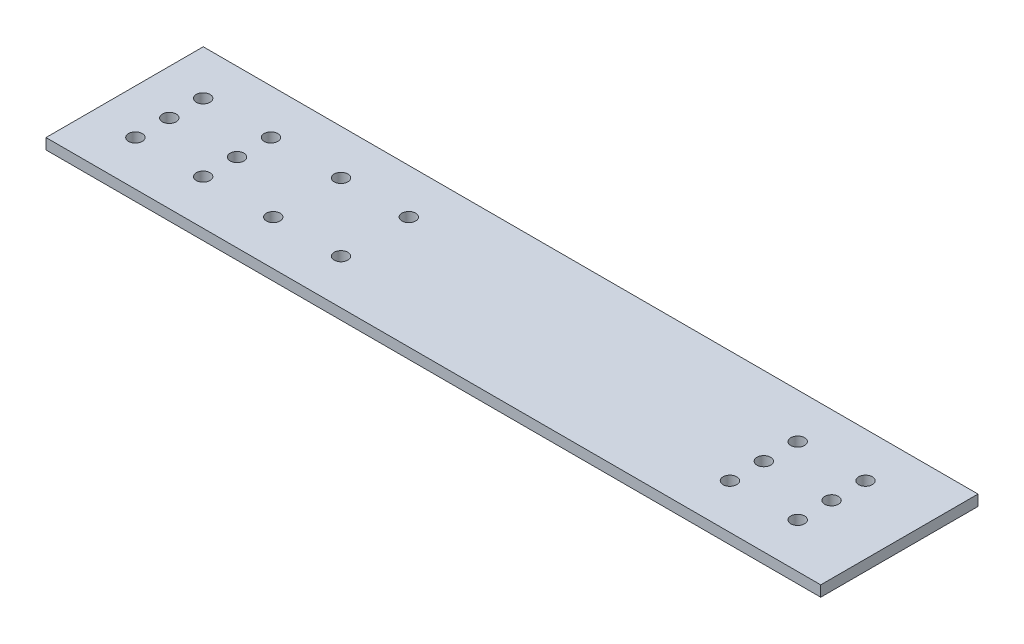
ISO-10303-21;
HEADER;
FILE_DESCRIPTION(('STEP AP214'),'2;1');
FILE_NAME('part.step','',(''),(''),'','','');
FILE_SCHEMA(('AUTOMOTIVE_DESIGN { 1 0 10303 214 1 1 1 1 }'));
ENDSEC;
DATA;
#1=APPLICATION_CONTEXT('core data for automotive mechanical design processes');
#2=APPLICATION_PROTOCOL_DEFINITION('international standard','automotive_design',2000,#1);
#3=PRODUCT_CONTEXT('',#1,'mechanical');
#4=PRODUCT('Part','Part','',(#3));
#5=PRODUCT_RELATED_PRODUCT_CATEGORY('part','',(#4));
#6=PRODUCT_DEFINITION_FORMATION('','',#4);
#7=PRODUCT_DEFINITION_CONTEXT('part definition',#1,'design');
#8=PRODUCT_DEFINITION('design','',#6,#7);
#9=PRODUCT_DEFINITION_SHAPE('','',#8);
#10=(LENGTH_UNIT() NAMED_UNIT(*) SI_UNIT(.MILLI.,.METRE.));
#11=(NAMED_UNIT(*) PLANE_ANGLE_UNIT() SI_UNIT($,.RADIAN.));
#12=(NAMED_UNIT(*) SI_UNIT($,.STERADIAN.) SOLID_ANGLE_UNIT());
#13=UNCERTAINTY_MEASURE_WITH_UNIT(LENGTH_MEASURE(1.E-05),#10,'distance_accuracy_value','');
#14=(GEOMETRIC_REPRESENTATION_CONTEXT(3) GLOBAL_UNCERTAINTY_ASSIGNED_CONTEXT((#13)) GLOBAL_UNIT_ASSIGNED_CONTEXT((#10,
#11,#12)) REPRESENTATION_CONTEXT('',''));
#15=CARTESIAN_POINT('',(0.,0.,0.));
#16=DIRECTION('',(0.,0.,1.));
#17=DIRECTION('',(1.,0.,0.));
#18=AXIS2_PLACEMENT_3D('',#15,#16,#17);
#19=CARTESIAN_POINT('',(0.,6.35,0.));
#20=DIRECTION('',(0.,-1.,0.));
#21=DIRECTION('',(0.,0.,-1.));
#22=AXIS2_PLACEMENT_3D('',#19,#20,#21);
#23=PLANE('',#22);
#24=DIRECTION('',(0.,0.,1.));
#25=VECTOR('',#24,1.);
#26=CARTESIAN_POINT('',(-46.35,6.35,-46.4));
#27=LINE('',#26,#25);
#28=CARTESIAN_POINT('',(-46.35,6.35,-46.4));
#29=VERTEX_POINT('',#28);
#30=CARTESIAN_POINT('',(-46.35,6.35,46.4));
#31=VERTEX_POINT('',#30);
#32=EDGE_CURVE('E86',#29,#31,#27,.T.);
#33=ORIENTED_EDGE('',*,*,#32,.T.);
#34=DIRECTION('',(1.,0.,0.));
#35=VECTOR('',#34,1.);
#36=CARTESIAN_POINT('',(410.85,6.35,46.3999999999999));
#37=LINE('',#36,#35);
#38=CARTESIAN_POINT('',(410.85,6.35,46.3999999999999));
#39=VERTEX_POINT('',#38);
#40=EDGE_CURVE('E81',#31,#39,#37,.T.);
#41=ORIENTED_EDGE('',*,*,#40,.T.);
#42=DIRECTION('',(0.,0.,-1.));
#43=VECTOR('',#42,1.);
#44=CARTESIAN_POINT('',(410.85,6.35,-46.4));
#45=LINE('',#44,#43);
#46=CARTESIAN_POINT('',(410.85,6.35,-46.4));
#47=VERTEX_POINT('',#46);
#48=EDGE_CURVE('E84',#39,#47,#45,.T.);
#49=ORIENTED_EDGE('',*,*,#48,.T.);
#50=DIRECTION('',(-1.,0.,0.));
#51=VECTOR('',#50,1.);
#52=CARTESIAN_POINT('',(-46.35,6.35,-46.4));
#53=LINE('',#52,#51);
#54=EDGE_CURVE('E51',#47,#29,#53,.T.);
#55=ORIENTED_EDGE('',*,*,#54,.T.);
#56=EDGE_LOOP('',(#33,#41,#49,#55));
#57=FACE_BOUND('',#56,.T.);
#58=CARTESIAN_POINT('',(-20.,6.35,-20.));
#59=DIRECTION('',(0.,1.,0.));
#60=DIRECTION('',(0.,0.,1.));
#61=AXIS2_PLACEMENT_3D('',#58,#59,#60);
#62=CIRCLE('',#61,4.05);
#63=CARTESIAN_POINT('',(-20.,6.35,-15.95));
#64=VERTEX_POINT('',#63);
#65=EDGE_CURVE('E101',#64,#64,#62,.T.);
#66=ORIENTED_EDGE('',*,*,#65,.F.);
#67=EDGE_LOOP('',(#66));
#68=FACE_BOUND('',#67,.T.);
#69=CARTESIAN_POINT('',(20.,6.35,-20.));
#70=DIRECTION('',(0.,1.,0.));
#71=DIRECTION('',(0.,0.,1.));
#72=AXIS2_PLACEMENT_3D('',#69,#70,#71);
#73=CIRCLE('',#72,4.05);
#74=CARTESIAN_POINT('',(20.,6.35,-15.95));
#75=VERTEX_POINT('',#74);
#76=EDGE_CURVE('E116',#75,#75,#73,.T.);
#77=ORIENTED_EDGE('',*,*,#76,.F.);
#78=EDGE_LOOP('',(#77));
#79=FACE_BOUND('',#78,.T.);
#80=CARTESIAN_POINT('',(20.,6.35,20.));
#81=DIRECTION('',(0.,1.,0.));
#82=DIRECTION('',(0.,0.,1.));
#83=AXIS2_PLACEMENT_3D('',#80,#81,#82);
#84=CIRCLE('',#83,4.05);
#85=CARTESIAN_POINT('',(20.,6.35,24.05));
#86=VERTEX_POINT('',#85);
#87=EDGE_CURVE('E122',#86,#86,#84,.T.);
#88=ORIENTED_EDGE('',*,*,#87,.F.);
#89=EDGE_LOOP('',(#88));
#90=FACE_BOUND('',#89,.T.);
#91=CARTESIAN_POINT('',(-20.,6.35,20.));
#92=DIRECTION('',(0.,1.,0.));
#93=DIRECTION('',(0.,0.,1.));
#94=AXIS2_PLACEMENT_3D('',#91,#92,#93);
#95=CIRCLE('',#94,4.05);
#96=CARTESIAN_POINT('',(-20.,6.35,24.05));
#97=VERTEX_POINT('',#96);
#98=EDGE_CURVE('E128',#97,#97,#95,.T.);
#99=ORIENTED_EDGE('',*,*,#98,.F.);
#100=EDGE_LOOP('',(#99));
#101=FACE_BOUND('',#100,.T.);
#102=CARTESIAN_POINT('',(-20.,6.35,0.));
#103=DIRECTION('',(0.,1.,0.));
#104=DIRECTION('',(0.,0.,1.));
#105=AXIS2_PLACEMENT_3D('',#102,#103,#104);
#106=CIRCLE('',#105,4.05);
#107=CARTESIAN_POINT('',(-20.,6.35,4.05));
#108=VERTEX_POINT('',#107);
#109=EDGE_CURVE('E134',#108,#108,#106,.T.);
#110=ORIENTED_EDGE('',*,*,#109,.F.);
#111=EDGE_LOOP('',(#110));
#112=FACE_BOUND('',#111,.T.);
#113=CARTESIAN_POINT('',(20.,6.35,0.));
#114=DIRECTION('',(0.,1.,0.));
#115=DIRECTION('',(0.,0.,1.));
#116=AXIS2_PLACEMENT_3D('',#113,#114,#115);
#117=CIRCLE('',#116,4.05);
#118=CARTESIAN_POINT('',(20.,6.35,4.05));
#119=VERTEX_POINT('',#118);
#120=EDGE_CURVE('E140',#119,#119,#117,.T.);
#121=ORIENTED_EDGE('',*,*,#120,.F.);
#122=EDGE_LOOP('',(#121));
#123=FACE_BOUND('',#122,.T.);
#124=CARTESIAN_POINT('',(330.85,6.35,-20.));
#125=DIRECTION('',(0.,1.,0.));
#126=DIRECTION('',(0.,0.,1.));
#127=AXIS2_PLACEMENT_3D('',#124,#125,#126);
#128=CIRCLE('',#127,4.05000000000002);
#129=CARTESIAN_POINT('',(330.85,6.35,-15.95));
#130=VERTEX_POINT('',#129);
#131=EDGE_CURVE('E146',#130,#130,#128,.T.);
#132=ORIENTED_EDGE('',*,*,#131,.F.);
#133=EDGE_LOOP('',(#132));
#134=FACE_BOUND('',#133,.T.);
#135=CARTESIAN_POINT('',(370.85,6.35,-20.));
#136=DIRECTION('',(0.,1.,0.));
#137=DIRECTION('',(0.,0.,1.));
#138=AXIS2_PLACEMENT_3D('',#135,#136,#137);
#139=CIRCLE('',#138,4.05000000000002);
#140=CARTESIAN_POINT('',(370.85,6.35,-15.95));
#141=VERTEX_POINT('',#140);
#142=EDGE_CURVE('E152',#141,#141,#139,.T.);
#143=ORIENTED_EDGE('',*,*,#142,.F.);
#144=EDGE_LOOP('',(#143));
#145=FACE_BOUND('',#144,.T.);
#146=CARTESIAN_POINT('',(370.85,6.35,20.));
#147=DIRECTION('',(0.,1.,0.));
#148=DIRECTION('',(0.,0.,1.));
#149=AXIS2_PLACEMENT_3D('',#146,#147,#148);
#150=CIRCLE('',#149,4.05000000000002);
#151=CARTESIAN_POINT('',(370.85,6.35,24.05));
#152=VERTEX_POINT('',#151);
#153=EDGE_CURVE('E158',#152,#152,#150,.T.);
#154=ORIENTED_EDGE('',*,*,#153,.F.);
#155=EDGE_LOOP('',(#154));
#156=FACE_BOUND('',#155,.T.);
#157=CARTESIAN_POINT('',(330.85,6.35,20.));
#158=DIRECTION('',(0.,1.,0.));
#159=DIRECTION('',(0.,0.,1.));
#160=AXIS2_PLACEMENT_3D('',#157,#158,#159);
#161=CIRCLE('',#160,4.05000000000002);
#162=CARTESIAN_POINT('',(330.85,6.35,24.05));
#163=VERTEX_POINT('',#162);
#164=EDGE_CURVE('E164',#163,#163,#161,.T.);
#165=ORIENTED_EDGE('',*,*,#164,.F.);
#166=EDGE_LOOP('',(#165));
#167=FACE_BOUND('',#166,.T.);
#168=CARTESIAN_POINT('',(61.35,6.35,-20.));
#169=DIRECTION('',(0.,1.,0.));
#170=DIRECTION('',(0.,0.,1.));
#171=AXIS2_PLACEMENT_3D('',#168,#169,#170);
#172=CIRCLE('',#171,4.05);
#173=CARTESIAN_POINT('',(61.35,6.35,-15.95));
#174=VERTEX_POINT('',#173);
#175=EDGE_CURVE('E170',#174,#174,#172,.T.);
#176=ORIENTED_EDGE('',*,*,#175,.F.);
#177=EDGE_LOOP('',(#176));
#178=FACE_BOUND('',#177,.T.);
#179=CARTESIAN_POINT('',(101.35,6.35,-20.));
#180=DIRECTION('',(0.,1.,0.));
#181=DIRECTION('',(0.,0.,1.));
#182=AXIS2_PLACEMENT_3D('',#179,#180,#181);
#183=CIRCLE('',#182,4.04999999999999);
#184=CARTESIAN_POINT('',(101.35,6.35,-15.95));
#185=VERTEX_POINT('',#184);
#186=EDGE_CURVE('E176',#185,#185,#183,.T.);
#187=ORIENTED_EDGE('',*,*,#186,.F.);
#188=EDGE_LOOP('',(#187));
#189=FACE_BOUND('',#188,.T.);
#190=CARTESIAN_POINT('',(330.85,6.35,0.));
#191=DIRECTION('',(0.,1.,0.));
#192=DIRECTION('',(0.,0.,1.));
#193=AXIS2_PLACEMENT_3D('',#190,#191,#192);
#194=CIRCLE('',#193,4.05000000000002);
#195=CARTESIAN_POINT('',(330.85,6.35,4.05000000000004));
#196=VERTEX_POINT('',#195);
#197=EDGE_CURVE('E182',#196,#196,#194,.T.);
#198=ORIENTED_EDGE('',*,*,#197,.F.);
#199=EDGE_LOOP('',(#198));
#200=FACE_BOUND('',#199,.T.);
#201=CARTESIAN_POINT('',(370.85,6.35,0.));
#202=DIRECTION('',(0.,1.,0.));
#203=DIRECTION('',(0.,0.,1.));
#204=AXIS2_PLACEMENT_3D('',#201,#202,#203);
#205=CIRCLE('',#204,4.05000000000002);
#206=CARTESIAN_POINT('',(370.85,6.35,4.05000000000004));
#207=VERTEX_POINT('',#206);
#208=EDGE_CURVE('E188',#207,#207,#205,.T.);
#209=ORIENTED_EDGE('',*,*,#208,.F.);
#210=EDGE_LOOP('',(#209));
#211=FACE_BOUND('',#210,.T.);
#212=CARTESIAN_POINT('',(101.35,6.35,20.));
#213=DIRECTION('',(0.,1.,0.));
#214=DIRECTION('',(0.,0.,1.));
#215=AXIS2_PLACEMENT_3D('',#212,#213,#214);
#216=CIRCLE('',#215,4.04999999999999);
#217=CARTESIAN_POINT('',(101.35,6.35,24.05));
#218=VERTEX_POINT('',#217);
#219=EDGE_CURVE('E194',#218,#218,#216,.T.);
#220=ORIENTED_EDGE('',*,*,#219,.F.);
#221=EDGE_LOOP('',(#220));
#222=FACE_BOUND('',#221,.T.);
#223=CARTESIAN_POINT('',(61.35,6.35,20.));
#224=DIRECTION('',(0.,1.,0.));
#225=DIRECTION('',(0.,0.,1.));
#226=AXIS2_PLACEMENT_3D('',#223,#224,#225);
#227=CIRCLE('',#226,4.05);
#228=CARTESIAN_POINT('',(61.35,6.35,24.05));
#229=VERTEX_POINT('',#228);
#230=EDGE_CURVE('E200',#229,#229,#227,.T.);
#231=ORIENTED_EDGE('',*,*,#230,.F.);
#232=EDGE_LOOP('',(#231));
#233=FACE_BOUND('',#232,.T.);
#234=ADVANCED_FACE('F34',(#57,#68,#79,#90,#101,#112,#123,#134,#145,#156,#167,#178,#189,#200,
#211,#222,#233),#23,.F.);
#235=CARTESIAN_POINT('',(0.,0.,0.));
#236=DIRECTION('',(0.,-1.,0.));
#237=DIRECTION('',(0.,0.,-1.));
#238=AXIS2_PLACEMENT_3D('',#235,#236,#237);
#239=PLANE('',#238);
#240=CARTESIAN_POINT('',(101.35,0.,20.));
#241=DIRECTION('',(0.,1.,0.));
#242=DIRECTION('',(0.,0.,1.));
#243=AXIS2_PLACEMENT_3D('',#240,#241,#242);
#244=CIRCLE('',#243,4.04999999999999);
#245=CARTESIAN_POINT('',(101.35,0.,24.05));
#246=VERTEX_POINT('',#245);
#247=EDGE_CURVE('E197',#246,#246,#244,.T.);
#248=ORIENTED_EDGE('',*,*,#247,.T.);
#249=EDGE_LOOP('',(#248));
#250=FACE_BOUND('',#249,.T.);
#251=CARTESIAN_POINT('',(330.85,0.,0.));
#252=DIRECTION('',(0.,1.,0.));
#253=DIRECTION('',(0.,0.,1.));
#254=AXIS2_PLACEMENT_3D('',#251,#252,#253);
#255=CIRCLE('',#254,4.05000000000002);
#256=CARTESIAN_POINT('',(330.85,0.,4.05000000000004));
#257=VERTEX_POINT('',#256);
#258=EDGE_CURVE('E185',#257,#257,#255,.T.);
#259=ORIENTED_EDGE('',*,*,#258,.T.);
#260=EDGE_LOOP('',(#259));
#261=FACE_BOUND('',#260,.T.);
#262=CARTESIAN_POINT('',(61.35,0.,-20.));
#263=DIRECTION('',(0.,1.,0.));
#264=DIRECTION('',(0.,0.,1.));
#265=AXIS2_PLACEMENT_3D('',#262,#263,#264);
#266=CIRCLE('',#265,4.05);
#267=CARTESIAN_POINT('',(61.35,0.,-15.95));
#268=VERTEX_POINT('',#267);
#269=EDGE_CURVE('E173',#268,#268,#266,.T.);
#270=ORIENTED_EDGE('',*,*,#269,.T.);
#271=EDGE_LOOP('',(#270));
#272=FACE_BOUND('',#271,.T.);
#273=CARTESIAN_POINT('',(370.85,0.,20.));
#274=DIRECTION('',(0.,1.,0.));
#275=DIRECTION('',(0.,0.,1.));
#276=AXIS2_PLACEMENT_3D('',#273,#274,#275);
#277=CIRCLE('',#276,4.05000000000002);
#278=CARTESIAN_POINT('',(370.85,0.,24.05));
#279=VERTEX_POINT('',#278);
#280=EDGE_CURVE('E161',#279,#279,#277,.T.);
#281=ORIENTED_EDGE('',*,*,#280,.T.);
#282=EDGE_LOOP('',(#281));
#283=FACE_BOUND('',#282,.T.);
#284=CARTESIAN_POINT('',(330.85,0.,-20.));
#285=DIRECTION('',(0.,1.,0.));
#286=DIRECTION('',(0.,0.,1.));
#287=AXIS2_PLACEMENT_3D('',#284,#285,#286);
#288=CIRCLE('',#287,4.05000000000002);
#289=CARTESIAN_POINT('',(330.85,0.,-15.95));
#290=VERTEX_POINT('',#289);
#291=EDGE_CURVE('E149',#290,#290,#288,.T.);
#292=ORIENTED_EDGE('',*,*,#291,.T.);
#293=EDGE_LOOP('',(#292));
#294=FACE_BOUND('',#293,.T.);
#295=CARTESIAN_POINT('',(-20.,0.,0.));
#296=DIRECTION('',(0.,1.,0.));
#297=DIRECTION('',(0.,0.,1.));
#298=AXIS2_PLACEMENT_3D('',#295,#296,#297);
#299=CIRCLE('',#298,4.05);
#300=CARTESIAN_POINT('',(-20.,0.,4.05));
#301=VERTEX_POINT('',#300);
#302=EDGE_CURVE('E137',#301,#301,#299,.T.);
#303=ORIENTED_EDGE('',*,*,#302,.T.);
#304=EDGE_LOOP('',(#303));
#305=FACE_BOUND('',#304,.T.);
#306=CARTESIAN_POINT('',(20.,0.,20.));
#307=DIRECTION('',(0.,1.,0.));
#308=DIRECTION('',(0.,0.,1.));
#309=AXIS2_PLACEMENT_3D('',#306,#307,#308);
#310=CIRCLE('',#309,4.05);
#311=CARTESIAN_POINT('',(20.,0.,24.05));
#312=VERTEX_POINT('',#311);
#313=EDGE_CURVE('E125',#312,#312,#310,.T.);
#314=ORIENTED_EDGE('',*,*,#313,.T.);
#315=EDGE_LOOP('',(#314));
#316=FACE_BOUND('',#315,.T.);
#317=CARTESIAN_POINT('',(-20.,0.,-20.));
#318=DIRECTION('',(0.,1.,0.));
#319=DIRECTION('',(0.,0.,1.));
#320=AXIS2_PLACEMENT_3D('',#317,#318,#319);
#321=CIRCLE('',#320,4.05);
#322=CARTESIAN_POINT('',(-20.,0.,-15.95));
#323=VERTEX_POINT('',#322);
#324=EDGE_CURVE('E113',#323,#323,#321,.T.);
#325=ORIENTED_EDGE('',*,*,#324,.T.);
#326=EDGE_LOOP('',(#325));
#327=FACE_BOUND('',#326,.T.);
#328=DIRECTION('',(0.,0.,1.));
#329=VECTOR('',#328,1.);
#330=CARTESIAN_POINT('',(-46.35,0.,-46.4));
#331=LINE('',#330,#329);
#332=CARTESIAN_POINT('',(-46.35,0.,-46.4));
#333=VERTEX_POINT('',#332);
#334=CARTESIAN_POINT('',(-46.35,0.,46.4));
#335=VERTEX_POINT('',#334);
#336=EDGE_CURVE('E98',#333,#335,#331,.T.);
#337=ORIENTED_EDGE('',*,*,#336,.F.);
#338=DIRECTION('',(-1.,0.,0.));
#339=VECTOR('',#338,1.);
#340=CARTESIAN_POINT('',(-46.35,0.,-46.4));
#341=LINE('',#340,#339);
#342=CARTESIAN_POINT('',(410.85,0.,-46.4));
#343=VERTEX_POINT('',#342);
#344=EDGE_CURVE('E74',#343,#333,#341,.T.);
#345=ORIENTED_EDGE('',*,*,#344,.F.);
#346=DIRECTION('',(0.,0.,-1.));
#347=VECTOR('',#346,1.);
#348=CARTESIAN_POINT('',(410.85,0.,-46.4));
#349=LINE('',#348,#347);
#350=CARTESIAN_POINT('',(410.85,0.,46.3999999999999));
#351=VERTEX_POINT('',#350);
#352=EDGE_CURVE('E68',#351,#343,#349,.T.);
#353=ORIENTED_EDGE('',*,*,#352,.F.);
#354=DIRECTION('',(1.,0.,0.));
#355=VECTOR('',#354,1.);
#356=CARTESIAN_POINT('',(410.85,0.,46.3999999999999));
#357=LINE('',#356,#355);
#358=EDGE_CURVE('E90',#335,#351,#357,.T.);
#359=ORIENTED_EDGE('',*,*,#358,.F.);
#360=EDGE_LOOP('',(#337,#345,#353,#359));
#361=FACE_BOUND('',#360,.T.);
#362=CARTESIAN_POINT('',(20.,0.,-20.));
#363=DIRECTION('',(0.,1.,0.));
#364=DIRECTION('',(0.,0.,1.));
#365=AXIS2_PLACEMENT_3D('',#362,#363,#364);
#366=CIRCLE('',#365,4.05);
#367=CARTESIAN_POINT('',(20.,0.,-15.95));
#368=VERTEX_POINT('',#367);
#369=EDGE_CURVE('E119',#368,#368,#366,.T.);
#370=ORIENTED_EDGE('',*,*,#369,.T.);
#371=EDGE_LOOP('',(#370));
#372=FACE_BOUND('',#371,.T.);
#373=CARTESIAN_POINT('',(-20.,0.,20.));
#374=DIRECTION('',(0.,1.,0.));
#375=DIRECTION('',(0.,0.,1.));
#376=AXIS2_PLACEMENT_3D('',#373,#374,#375);
#377=CIRCLE('',#376,4.05);
#378=CARTESIAN_POINT('',(-20.,0.,24.05));
#379=VERTEX_POINT('',#378);
#380=EDGE_CURVE('E131',#379,#379,#377,.T.);
#381=ORIENTED_EDGE('',*,*,#380,.T.);
#382=EDGE_LOOP('',(#381));
#383=FACE_BOUND('',#382,.T.);
#384=CARTESIAN_POINT('',(20.,0.,0.));
#385=DIRECTION('',(0.,1.,0.));
#386=DIRECTION('',(0.,0.,1.));
#387=AXIS2_PLACEMENT_3D('',#384,#385,#386);
#388=CIRCLE('',#387,4.05);
#389=CARTESIAN_POINT('',(20.,0.,4.05));
#390=VERTEX_POINT('',#389);
#391=EDGE_CURVE('E143',#390,#390,#388,.T.);
#392=ORIENTED_EDGE('',*,*,#391,.T.);
#393=EDGE_LOOP('',(#392));
#394=FACE_BOUND('',#393,.T.);
#395=CARTESIAN_POINT('',(370.85,0.,-20.));
#396=DIRECTION('',(0.,1.,0.));
#397=DIRECTION('',(0.,0.,1.));
#398=AXIS2_PLACEMENT_3D('',#395,#396,#397);
#399=CIRCLE('',#398,4.05000000000002);
#400=CARTESIAN_POINT('',(370.85,0.,-15.95));
#401=VERTEX_POINT('',#400);
#402=EDGE_CURVE('E155',#401,#401,#399,.T.);
#403=ORIENTED_EDGE('',*,*,#402,.T.);
#404=EDGE_LOOP('',(#403));
#405=FACE_BOUND('',#404,.T.);
#406=CARTESIAN_POINT('',(330.85,0.,20.));
#407=DIRECTION('',(0.,1.,0.));
#408=DIRECTION('',(0.,0.,1.));
#409=AXIS2_PLACEMENT_3D('',#406,#407,#408);
#410=CIRCLE('',#409,4.05000000000002);
#411=CARTESIAN_POINT('',(330.85,0.,24.05));
#412=VERTEX_POINT('',#411);
#413=EDGE_CURVE('E167',#412,#412,#410,.T.);
#414=ORIENTED_EDGE('',*,*,#413,.T.);
#415=EDGE_LOOP('',(#414));
#416=FACE_BOUND('',#415,.T.);
#417=CARTESIAN_POINT('',(101.35,0.,-20.));
#418=DIRECTION('',(0.,1.,0.));
#419=DIRECTION('',(0.,0.,1.));
#420=AXIS2_PLACEMENT_3D('',#417,#418,#419);
#421=CIRCLE('',#420,4.04999999999999);
#422=CARTESIAN_POINT('',(101.35,0.,-15.95));
#423=VERTEX_POINT('',#422);
#424=EDGE_CURVE('E179',#423,#423,#421,.T.);
#425=ORIENTED_EDGE('',*,*,#424,.T.);
#426=EDGE_LOOP('',(#425));
#427=FACE_BOUND('',#426,.T.);
#428=CARTESIAN_POINT('',(370.85,0.,0.));
#429=DIRECTION('',(0.,1.,0.));
#430=DIRECTION('',(0.,0.,1.));
#431=AXIS2_PLACEMENT_3D('',#428,#429,#430);
#432=CIRCLE('',#431,4.05000000000002);
#433=CARTESIAN_POINT('',(370.85,0.,4.05000000000004));
#434=VERTEX_POINT('',#433);
#435=EDGE_CURVE('E191',#434,#434,#432,.T.);
#436=ORIENTED_EDGE('',*,*,#435,.T.);
#437=EDGE_LOOP('',(#436));
#438=FACE_BOUND('',#437,.T.);
#439=CARTESIAN_POINT('',(61.35,0.,20.));
#440=DIRECTION('',(0.,1.,0.));
#441=DIRECTION('',(0.,0.,1.));
#442=AXIS2_PLACEMENT_3D('',#439,#440,#441);
#443=CIRCLE('',#442,4.05);
#444=CARTESIAN_POINT('',(61.35,0.,24.05));
#445=VERTEX_POINT('',#444);
#446=EDGE_CURVE('E203',#445,#445,#443,.T.);
#447=ORIENTED_EDGE('',*,*,#446,.T.);
#448=EDGE_LOOP('',(#447));
#449=FACE_BOUND('',#448,.T.);
#450=ADVANCED_FACE('F109',(#250,#261,#272,#283,#294,#305,#316,#327,#361,#372,#383,#394,#405,
#416,#427,#438,#449),#239,.T.);
#451=CARTESIAN_POINT('',(-46.35,6.35,-46.4));
#452=DIRECTION('',(1.,0.,0.));
#453=DIRECTION('',(0.,0.,-1.));
#454=AXIS2_PLACEMENT_3D('',#451,#452,#453);
#455=PLANE('',#454);
#456=ORIENTED_EDGE('',*,*,#336,.T.);
#457=DIRECTION('',(0.,-1.,0.));
#458=VECTOR('',#457,1.);
#459=CARTESIAN_POINT('',(-46.35,6.35,46.4));
#460=LINE('',#459,#458);
#461=EDGE_CURVE('E11',#31,#335,#460,.T.);
#462=ORIENTED_EDGE('',*,*,#461,.F.);
#463=ORIENTED_EDGE('',*,*,#32,.F.);
#464=DIRECTION('',(0.,-1.,0.));
#465=VECTOR('',#464,1.);
#466=CARTESIAN_POINT('',(-46.35,6.35,-46.4));
#467=LINE('',#466,#465);
#468=EDGE_CURVE('E94',#29,#333,#467,.T.);
#469=ORIENTED_EDGE('',*,*,#468,.T.);
#470=EDGE_LOOP('',(#456,#462,#463,#469));
#471=FACE_BOUND('',#470,.T.);
#472=ADVANCED_FACE('F36',(#471),#455,.F.);
#473=CARTESIAN_POINT('',(410.85,6.35,46.3999999999999));
#474=DIRECTION('',(0.,0.,-1.));
#475=DIRECTION('',(-1.,0.,0.));
#476=AXIS2_PLACEMENT_3D('',#473,#474,#475);
#477=PLANE('',#476);
#478=ORIENTED_EDGE('',*,*,#358,.T.);
#479=DIRECTION('',(0.,-1.,0.));
#480=VECTOR('',#479,1.);
#481=CARTESIAN_POINT('',(410.85,6.35,46.3999999999999));
#482=LINE('',#481,#480);
#483=EDGE_CURVE('E43',#39,#351,#482,.T.);
#484=ORIENTED_EDGE('',*,*,#483,.F.);
#485=ORIENTED_EDGE('',*,*,#40,.F.);
#486=ORIENTED_EDGE('',*,*,#461,.T.);
#487=EDGE_LOOP('',(#478,#484,#485,#486));
#488=FACE_BOUND('',#487,.T.);
#489=ADVANCED_FACE('F89',(#488),#477,.F.);
#490=CARTESIAN_POINT('',(410.85,6.35,-46.4));
#491=DIRECTION('',(-1.,0.,0.));
#492=DIRECTION('',(0.,0.,1.));
#493=AXIS2_PLACEMENT_3D('',#490,#491,#492);
#494=PLANE('',#493);
#495=ORIENTED_EDGE('',*,*,#352,.T.);
#496=DIRECTION('',(0.,-1.,0.));
#497=VECTOR('',#496,1.);
#498=CARTESIAN_POINT('',(410.85,6.35,-46.4));
#499=LINE('',#498,#497);
#500=EDGE_CURVE('E91',#47,#343,#499,.T.);
#501=ORIENTED_EDGE('',*,*,#500,.F.);
#502=ORIENTED_EDGE('',*,*,#48,.F.);
#503=ORIENTED_EDGE('',*,*,#483,.T.);
#504=EDGE_LOOP('',(#495,#501,#502,#503));
#505=FACE_BOUND('',#504,.T.);
#506=ADVANCED_FACE('F92',(#505),#494,.F.);
#507=CARTESIAN_POINT('',(-46.35,6.35,-46.4));
#508=DIRECTION('',(0.,0.,1.));
#509=DIRECTION('',(1.,0.,0.));
#510=AXIS2_PLACEMENT_3D('',#507,#508,#509);
#511=PLANE('',#510);
#512=ORIENTED_EDGE('',*,*,#344,.T.);
#513=ORIENTED_EDGE('',*,*,#468,.F.);
#514=ORIENTED_EDGE('',*,*,#54,.F.);
#515=ORIENTED_EDGE('',*,*,#500,.T.);
#516=EDGE_LOOP('',(#512,#513,#514,#515));
#517=FACE_BOUND('',#516,.T.);
#518=ADVANCED_FACE('F106',(#517),#511,.F.);
#519=CARTESIAN_POINT('',(-20.,6.35,-20.));
#520=DIRECTION('',(0.,-1.,0.));
#521=DIRECTION('',(0.,0.,-1.));
#522=AXIS2_PLACEMENT_3D('',#519,#520,#521);
#523=CYLINDRICAL_SURFACE('',#522,4.05);
#524=ORIENTED_EDGE('',*,*,#65,.T.);
#525=EDGE_LOOP('',(#524));
#526=FACE_BOUND('',#525,.T.);
#527=ORIENTED_EDGE('',*,*,#324,.F.);
#528=EDGE_LOOP('',(#527));
#529=FACE_BOUND('',#528,.T.);
#530=ADVANCED_FACE('F220',(#526,#529),#523,.F.);
#531=CARTESIAN_POINT('',(20.,6.35,-20.));
#532=DIRECTION('',(0.,-1.,0.));
#533=DIRECTION('',(0.,0.,-1.));
#534=AXIS2_PLACEMENT_3D('',#531,#532,#533);
#535=CYLINDRICAL_SURFACE('',#534,4.05);
#536=ORIENTED_EDGE('',*,*,#76,.T.);
#537=EDGE_LOOP('',(#536));
#538=FACE_BOUND('',#537,.T.);
#539=ORIENTED_EDGE('',*,*,#369,.F.);
#540=EDGE_LOOP('',(#539));
#541=FACE_BOUND('',#540,.T.);
#542=ADVANCED_FACE('F266',(#538,#541),#535,.F.);
#543=CARTESIAN_POINT('',(20.,6.35,20.));
#544=DIRECTION('',(0.,-1.,0.));
#545=DIRECTION('',(0.,0.,-1.));
#546=AXIS2_PLACEMENT_3D('',#543,#544,#545);
#547=CYLINDRICAL_SURFACE('',#546,4.05);
#548=ORIENTED_EDGE('',*,*,#87,.T.);
#549=EDGE_LOOP('',(#548));
#550=FACE_BOUND('',#549,.T.);
#551=ORIENTED_EDGE('',*,*,#313,.F.);
#552=EDGE_LOOP('',(#551));
#553=FACE_BOUND('',#552,.T.);
#554=ADVANCED_FACE('F274',(#550,#553),#547,.F.);
#555=CARTESIAN_POINT('',(-20.,6.35,20.));
#556=DIRECTION('',(0.,-1.,0.));
#557=DIRECTION('',(0.,0.,-1.));
#558=AXIS2_PLACEMENT_3D('',#555,#556,#557);
#559=CYLINDRICAL_SURFACE('',#558,4.05);
#560=ORIENTED_EDGE('',*,*,#98,.T.);
#561=EDGE_LOOP('',(#560));
#562=FACE_BOUND('',#561,.T.);
#563=ORIENTED_EDGE('',*,*,#380,.F.);
#564=EDGE_LOOP('',(#563));
#565=FACE_BOUND('',#564,.T.);
#566=ADVANCED_FACE('F282',(#562,#565),#559,.F.);
#567=CARTESIAN_POINT('',(-20.,6.35,0.));
#568=DIRECTION('',(0.,-1.,0.));
#569=DIRECTION('',(0.,0.,-1.));
#570=AXIS2_PLACEMENT_3D('',#567,#568,#569);
#571=CYLINDRICAL_SURFACE('',#570,4.05);
#572=ORIENTED_EDGE('',*,*,#109,.T.);
#573=EDGE_LOOP('',(#572));
#574=FACE_BOUND('',#573,.T.);
#575=ORIENTED_EDGE('',*,*,#302,.F.);
#576=EDGE_LOOP('',(#575));
#577=FACE_BOUND('',#576,.T.);
#578=ADVANCED_FACE('F291',(#574,#577),#571,.F.);
#579=CARTESIAN_POINT('',(20.,6.35,0.));
#580=DIRECTION('',(0.,-1.,0.));
#581=DIRECTION('',(0.,0.,-1.));
#582=AXIS2_PLACEMENT_3D('',#579,#580,#581);
#583=CYLINDRICAL_SURFACE('',#582,4.05);
#584=ORIENTED_EDGE('',*,*,#120,.T.);
#585=EDGE_LOOP('',(#584));
#586=FACE_BOUND('',#585,.T.);
#587=ORIENTED_EDGE('',*,*,#391,.F.);
#588=EDGE_LOOP('',(#587));
#589=FACE_BOUND('',#588,.T.);
#590=ADVANCED_FACE('F300',(#586,#589),#583,.F.);
#591=CARTESIAN_POINT('',(330.85,6.35,-20.));
#592=DIRECTION('',(0.,-1.,0.));
#593=DIRECTION('',(0.,0.,-1.));
#594=AXIS2_PLACEMENT_3D('',#591,#592,#593);
#595=CYLINDRICAL_SURFACE('',#594,4.05000000000002);
#596=ORIENTED_EDGE('',*,*,#131,.T.);
#597=EDGE_LOOP('',(#596));
#598=FACE_BOUND('',#597,.T.);
#599=ORIENTED_EDGE('',*,*,#291,.F.);
#600=EDGE_LOOP('',(#599));
#601=FACE_BOUND('',#600,.T.);
#602=ADVANCED_FACE('F309',(#598,#601),#595,.F.);
#603=CARTESIAN_POINT('',(370.85,6.35,-20.));
#604=DIRECTION('',(0.,-1.,0.));
#605=DIRECTION('',(0.,0.,-1.));
#606=AXIS2_PLACEMENT_3D('',#603,#604,#605);
#607=CYLINDRICAL_SURFACE('',#606,4.05000000000002);
#608=ORIENTED_EDGE('',*,*,#142,.T.);
#609=EDGE_LOOP('',(#608));
#610=FACE_BOUND('',#609,.T.);
#611=ORIENTED_EDGE('',*,*,#402,.F.);
#612=EDGE_LOOP('',(#611));
#613=FACE_BOUND('',#612,.T.);
#614=ADVANCED_FACE('F318',(#610,#613),#607,.F.);
#615=CARTESIAN_POINT('',(370.85,6.35,20.));
#616=DIRECTION('',(0.,-1.,0.));
#617=DIRECTION('',(0.,0.,-1.));
#618=AXIS2_PLACEMENT_3D('',#615,#616,#617);
#619=CYLINDRICAL_SURFACE('',#618,4.05000000000002);
#620=ORIENTED_EDGE('',*,*,#153,.T.);
#621=EDGE_LOOP('',(#620));
#622=FACE_BOUND('',#621,.T.);
#623=ORIENTED_EDGE('',*,*,#280,.F.);
#624=EDGE_LOOP('',(#623));
#625=FACE_BOUND('',#624,.T.);
#626=ADVANCED_FACE('F327',(#622,#625),#619,.F.);
#627=CARTESIAN_POINT('',(330.85,6.35,20.));
#628=DIRECTION('',(0.,-1.,0.));
#629=DIRECTION('',(0.,0.,-1.));
#630=AXIS2_PLACEMENT_3D('',#627,#628,#629);
#631=CYLINDRICAL_SURFACE('',#630,4.05000000000002);
#632=ORIENTED_EDGE('',*,*,#164,.T.);
#633=EDGE_LOOP('',(#632));
#634=FACE_BOUND('',#633,.T.);
#635=ORIENTED_EDGE('',*,*,#413,.F.);
#636=EDGE_LOOP('',(#635));
#637=FACE_BOUND('',#636,.T.);
#638=ADVANCED_FACE('F336',(#634,#637),#631,.F.);
#639=CARTESIAN_POINT('',(61.35,6.35,-20.));
#640=DIRECTION('',(0.,-1.,0.));
#641=DIRECTION('',(0.,0.,-1.));
#642=AXIS2_PLACEMENT_3D('',#639,#640,#641);
#643=CYLINDRICAL_SURFACE('',#642,4.05);
#644=ORIENTED_EDGE('',*,*,#175,.T.);
#645=EDGE_LOOP('',(#644));
#646=FACE_BOUND('',#645,.T.);
#647=ORIENTED_EDGE('',*,*,#269,.F.);
#648=EDGE_LOOP('',(#647));
#649=FACE_BOUND('',#648,.T.);
#650=ADVANCED_FACE('F345',(#646,#649),#643,.F.);
#651=CARTESIAN_POINT('',(101.35,6.35,-20.));
#652=DIRECTION('',(0.,-1.,0.));
#653=DIRECTION('',(0.,0.,-1.));
#654=AXIS2_PLACEMENT_3D('',#651,#652,#653);
#655=CYLINDRICAL_SURFACE('',#654,4.04999999999999);
#656=ORIENTED_EDGE('',*,*,#186,.T.);
#657=EDGE_LOOP('',(#656));
#658=FACE_BOUND('',#657,.T.);
#659=ORIENTED_EDGE('',*,*,#424,.F.);
#660=EDGE_LOOP('',(#659));
#661=FACE_BOUND('',#660,.T.);
#662=ADVANCED_FACE('F354',(#658,#661),#655,.F.);
#663=CARTESIAN_POINT('',(330.85,6.35,0.));
#664=DIRECTION('',(0.,-1.,0.));
#665=DIRECTION('',(0.,0.,-1.));
#666=AXIS2_PLACEMENT_3D('',#663,#664,#665);
#667=CYLINDRICAL_SURFACE('',#666,4.05000000000002);
#668=ORIENTED_EDGE('',*,*,#197,.T.);
#669=EDGE_LOOP('',(#668));
#670=FACE_BOUND('',#669,.T.);
#671=ORIENTED_EDGE('',*,*,#258,.F.);
#672=EDGE_LOOP('',(#671));
#673=FACE_BOUND('',#672,.T.);
#674=ADVANCED_FACE('F363',(#670,#673),#667,.F.);
#675=CARTESIAN_POINT('',(370.85,6.35,0.));
#676=DIRECTION('',(0.,-1.,0.));
#677=DIRECTION('',(0.,0.,-1.));
#678=AXIS2_PLACEMENT_3D('',#675,#676,#677);
#679=CYLINDRICAL_SURFACE('',#678,4.05000000000002);
#680=ORIENTED_EDGE('',*,*,#208,.T.);
#681=EDGE_LOOP('',(#680));
#682=FACE_BOUND('',#681,.T.);
#683=ORIENTED_EDGE('',*,*,#435,.F.);
#684=EDGE_LOOP('',(#683));
#685=FACE_BOUND('',#684,.T.);
#686=ADVANCED_FACE('F372',(#682,#685),#679,.F.);
#687=CARTESIAN_POINT('',(101.35,6.35,20.));
#688=DIRECTION('',(0.,-1.,0.));
#689=DIRECTION('',(0.,0.,-1.));
#690=AXIS2_PLACEMENT_3D('',#687,#688,#689);
#691=CYLINDRICAL_SURFACE('',#690,4.04999999999999);
#692=ORIENTED_EDGE('',*,*,#219,.T.);
#693=EDGE_LOOP('',(#692));
#694=FACE_BOUND('',#693,.T.);
#695=ORIENTED_EDGE('',*,*,#247,.F.);
#696=EDGE_LOOP('',(#695));
#697=FACE_BOUND('',#696,.T.);
#698=ADVANCED_FACE('F381',(#694,#697),#691,.F.);
#699=CARTESIAN_POINT('',(61.35,6.35,20.));
#700=DIRECTION('',(0.,-1.,0.));
#701=DIRECTION('',(0.,0.,-1.));
#702=AXIS2_PLACEMENT_3D('',#699,#700,#701);
#703=CYLINDRICAL_SURFACE('',#702,4.05);
#704=ORIENTED_EDGE('',*,*,#230,.T.);
#705=EDGE_LOOP('',(#704));
#706=FACE_BOUND('',#705,.T.);
#707=ORIENTED_EDGE('',*,*,#446,.F.);
#708=EDGE_LOOP('',(#707));
#709=FACE_BOUND('',#708,.T.);
#710=ADVANCED_FACE('F209',(#706,#709),#703,.F.);
#711=CLOSED_SHELL('',(#234,#450,#472,#489,#506,#518,#530,#542,#554,#566,#578,#590,#602,#614,
#626,#638,#650,#662,#674,#686,#698,#710));
#712=MANIFOLD_SOLID_BREP('B2',#711);
#713=ADVANCED_BREP_SHAPE_REPRESENTATION('',(#18,#712),#14);
#714=SHAPE_DEFINITION_REPRESENTATION(#9,#713);
ENDSEC;
END-ISO-10303-21;
